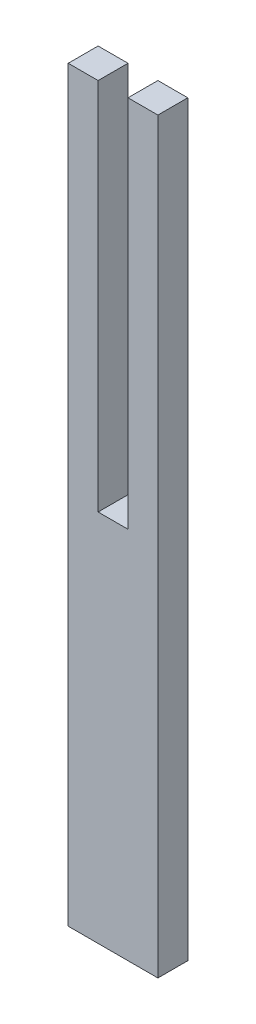
ISO-10303-21;
HEADER;
FILE_DESCRIPTION(('STEP AP214'),'2;1');
FILE_NAME('part.step','',(''),(''),'','','');
FILE_SCHEMA(('AUTOMOTIVE_DESIGN { 1 0 10303 214 1 1 1 1 }'));
ENDSEC;
DATA;
#1=APPLICATION_CONTEXT('core data for automotive mechanical design processes');
#2=APPLICATION_PROTOCOL_DEFINITION('international standard','automotive_design',2000,#1);
#3=PRODUCT_CONTEXT('',#1,'mechanical');
#4=PRODUCT('Part','Part','',(#3));
#5=PRODUCT_RELATED_PRODUCT_CATEGORY('part','',(#4));
#6=PRODUCT_DEFINITION_FORMATION('','',#4);
#7=PRODUCT_DEFINITION_CONTEXT('part definition',#1,'design');
#8=PRODUCT_DEFINITION('design','',#6,#7);
#9=PRODUCT_DEFINITION_SHAPE('','',#8);
#10=(LENGTH_UNIT() NAMED_UNIT(*) SI_UNIT(.MILLI.,.METRE.));
#11=(NAMED_UNIT(*) PLANE_ANGLE_UNIT() SI_UNIT($,.RADIAN.));
#12=(NAMED_UNIT(*) SI_UNIT($,.STERADIAN.) SOLID_ANGLE_UNIT());
#13=UNCERTAINTY_MEASURE_WITH_UNIT(LENGTH_MEASURE(1.E-05),#10,'distance_accuracy_value','');
#14=(GEOMETRIC_REPRESENTATION_CONTEXT(3) GLOBAL_UNCERTAINTY_ASSIGNED_CONTEXT((#13)) GLOBAL_UNIT_ASSIGNED_CONTEXT((#10,
#11,#12)) REPRESENTATION_CONTEXT('',''));
#15=CARTESIAN_POINT('',(0.,0.,0.));
#16=DIRECTION('',(0.,0.,1.));
#17=DIRECTION('',(1.,0.,0.));
#18=AXIS2_PLACEMENT_3D('',#15,#16,#17);
#19=CARTESIAN_POINT('',(-23.2046590205584,42.8960656443759,5.08));
#20=DIRECTION('',(0.,-1.,0.));
#21=DIRECTION('',(0.,0.,-1.));
#22=AXIS2_PLACEMENT_3D('',#19,#20,#21);
#23=PLANE('',#22);
#24=DIRECTION('',(-1.,0.,0.));
#25=VECTOR('',#24,1.);
#26=CARTESIAN_POINT('',(-23.2046590205584,42.8960656443759,0.));
#27=LINE('',#26,#25);
#28=CARTESIAN_POINT('',(-23.2046590205584,42.8960656443759,0.));
#29=VERTEX_POINT('',#28);
#30=CARTESIAN_POINT('',(-28.2846590205584,42.8960656443759,0.));
#31=VERTEX_POINT('',#30);
#32=EDGE_CURVE('E129',#29,#31,#27,.T.);
#33=ORIENTED_EDGE('',*,*,#32,.T.);
#34=DIRECTION('',(0.,0.,-1.));
#35=VECTOR('',#34,1.);
#36=CARTESIAN_POINT('',(-28.2846590205584,42.8960656443759,5.08));
#37=LINE('',#36,#35);
#38=CARTESIAN_POINT('',(-28.2846590205584,42.8960656443759,5.08));
#39=VERTEX_POINT('',#38);
#40=EDGE_CURVE('E11',#39,#31,#37,.T.);
#41=ORIENTED_EDGE('',*,*,#40,.F.);
#42=DIRECTION('',(-1.,0.,0.));
#43=VECTOR('',#42,1.);
#44=CARTESIAN_POINT('',(-23.2046590205584,42.8960656443759,5.08));
#45=LINE('',#44,#43);
#46=CARTESIAN_POINT('',(-23.2046590205584,42.8960656443759,5.08));
#47=VERTEX_POINT('',#46);
#48=EDGE_CURVE('E143',#47,#39,#45,.T.);
#49=ORIENTED_EDGE('',*,*,#48,.F.);
#50=DIRECTION('',(0.,0.,-1.));
#51=VECTOR('',#50,1.);
#52=CARTESIAN_POINT('',(-23.2046590205584,42.8960656443759,5.08));
#53=LINE('',#52,#51);
#54=EDGE_CURVE('E125',#47,#29,#53,.T.);
#55=ORIENTED_EDGE('',*,*,#54,.T.);
#56=EDGE_LOOP('',(#33,#41,#49,#55));
#57=FACE_BOUND('',#56,.T.);
#58=ADVANCED_FACE('F33',(#57),#23,.F.);
#59=CARTESIAN_POINT('',(-28.2846590205584,42.8960656443759,5.08));
#60=DIRECTION('',(1.,0.,0.));
#61=DIRECTION('',(0.,1.,0.));
#62=AXIS2_PLACEMENT_3D('',#59,#60,#61);
#63=PLANE('',#62);
#64=DIRECTION('',(0.,-1.,0.));
#65=VECTOR('',#64,1.);
#66=CARTESIAN_POINT('',(-28.2846590205584,42.8960656443759,0.));
#67=LINE('',#66,#65);
#68=CARTESIAN_POINT('',(-28.2846590205584,-84.1039343556241,0.));
#69=VERTEX_POINT('',#68);
#70=EDGE_CURVE('E132',#31,#69,#67,.T.);
#71=ORIENTED_EDGE('',*,*,#70,.T.);
#72=DIRECTION('',(0.,0.,-1.));
#73=VECTOR('',#72,1.);
#74=CARTESIAN_POINT('',(-28.2846590205584,-84.1039343556241,5.08));
#75=LINE('',#74,#73);
#76=CARTESIAN_POINT('',(-28.2846590205584,-84.1039343556241,5.08));
#77=VERTEX_POINT('',#76);
#78=EDGE_CURVE('E41',#77,#69,#75,.T.);
#79=ORIENTED_EDGE('',*,*,#78,.F.);
#80=DIRECTION('',(0.,-1.,0.));
#81=VECTOR('',#80,1.);
#82=CARTESIAN_POINT('',(-28.2846590205584,42.8960656443759,5.08));
#83=LINE('',#82,#81);
#84=EDGE_CURVE('E92',#39,#77,#83,.T.);
#85=ORIENTED_EDGE('',*,*,#84,.F.);
#86=ORIENTED_EDGE('',*,*,#40,.T.);
#87=EDGE_LOOP('',(#71,#79,#85,#86));
#88=FACE_BOUND('',#87,.T.);
#89=ADVANCED_FACE('F178',(#88),#63,.F.);
#90=CARTESIAN_POINT('',(-28.2846590205584,-84.1039343556241,5.08));
#91=DIRECTION('',(0.,1.,0.));
#92=DIRECTION('',(0.,0.,1.));
#93=AXIS2_PLACEMENT_3D('',#90,#91,#92);
#94=PLANE('',#93);
#95=DIRECTION('',(1.,0.,0.));
#96=VECTOR('',#95,1.);
#97=CARTESIAN_POINT('',(-28.2846590205584,-84.1039343556241,0.));
#98=LINE('',#97,#96);
#99=CARTESIAN_POINT('',(-13.0446590205584,-84.1039343556241,0.));
#100=VERTEX_POINT('',#99);
#101=EDGE_CURVE('E134',#69,#100,#98,.T.);
#102=ORIENTED_EDGE('',*,*,#101,.T.);
#103=DIRECTION('',(0.,0.,-1.));
#104=VECTOR('',#103,1.);
#105=CARTESIAN_POINT('',(-13.0446590205584,-84.1039343556241,5.08));
#106=LINE('',#105,#104);
#107=CARTESIAN_POINT('',(-13.0446590205584,-84.1039343556241,5.08));
#108=VERTEX_POINT('',#107);
#109=EDGE_CURVE('E150',#108,#100,#106,.T.);
#110=ORIENTED_EDGE('',*,*,#109,.F.);
#111=DIRECTION('',(1.,0.,0.));
#112=VECTOR('',#111,1.);
#113=CARTESIAN_POINT('',(-28.2846590205584,-84.1039343556241,5.08));
#114=LINE('',#113,#112);
#115=EDGE_CURVE('E158',#77,#108,#114,.T.);
#116=ORIENTED_EDGE('',*,*,#115,.F.);
#117=ORIENTED_EDGE('',*,*,#78,.T.);
#118=EDGE_LOOP('',(#102,#110,#116,#117));
#119=FACE_BOUND('',#118,.T.);
#120=ADVANCED_FACE('F156',(#119),#94,.F.);
#121=CARTESIAN_POINT('',(-13.0446590205584,-84.1039343556241,5.08));
#122=DIRECTION('',(-1.,0.,0.));
#123=DIRECTION('',(0.,0.,1.));
#124=AXIS2_PLACEMENT_3D('',#121,#122,#123);
#125=PLANE('',#124);
#126=DIRECTION('',(0.,1.,0.));
#127=VECTOR('',#126,1.);
#128=CARTESIAN_POINT('',(-13.0446590205584,-84.1039343556241,0.));
#129=LINE('',#128,#127);
#130=CARTESIAN_POINT('',(-13.0446590205584,42.8960656443759,0.));
#131=VERTEX_POINT('',#130);
#132=EDGE_CURVE('E136',#100,#131,#129,.T.);
#133=ORIENTED_EDGE('',*,*,#132,.T.);
#134=DIRECTION('',(0.,0.,-1.));
#135=VECTOR('',#134,1.);
#136=CARTESIAN_POINT('',(-13.0446590205584,42.8960656443759,5.08));
#137=LINE('',#136,#135);
#138=CARTESIAN_POINT('',(-13.0446590205584,42.8960656443759,5.08));
#139=VERTEX_POINT('',#138);
#140=EDGE_CURVE('E147',#139,#131,#137,.T.);
#141=ORIENTED_EDGE('',*,*,#140,.F.);
#142=DIRECTION('',(0.,1.,0.));
#143=VECTOR('',#142,1.);
#144=CARTESIAN_POINT('',(-13.0446590205584,-84.1039343556241,5.08));
#145=LINE('',#144,#143);
#146=EDGE_CURVE('E170',#108,#139,#145,.T.);
#147=ORIENTED_EDGE('',*,*,#146,.F.);
#148=ORIENTED_EDGE('',*,*,#109,.T.);
#149=EDGE_LOOP('',(#133,#141,#147,#148));
#150=FACE_BOUND('',#149,.T.);
#151=ADVANCED_FACE('F166',(#150),#125,.F.);
#152=CARTESIAN_POINT('',(-13.0446590205584,42.8960656443759,5.08));
#153=DIRECTION('',(0.,-1.,0.));
#154=DIRECTION('',(0.,0.,-1.));
#155=AXIS2_PLACEMENT_3D('',#152,#153,#154);
#156=PLANE('',#155);
#157=DIRECTION('',(-1.,0.,0.));
#158=VECTOR('',#157,1.);
#159=CARTESIAN_POINT('',(-13.0446590205584,42.8960656443759,0.));
#160=LINE('',#159,#158);
#161=CARTESIAN_POINT('',(-18.1246590205584,42.8960656443759,0.));
#162=VERTEX_POINT('',#161);
#163=EDGE_CURVE('E138',#131,#162,#160,.T.);
#164=ORIENTED_EDGE('',*,*,#163,.T.);
#165=DIRECTION('',(0.,0.,-1.));
#166=VECTOR('',#165,1.);
#167=CARTESIAN_POINT('',(-18.1246590205584,42.8960656443759,5.08));
#168=LINE('',#167,#166);
#169=CARTESIAN_POINT('',(-18.1246590205584,42.8960656443759,5.08));
#170=VERTEX_POINT('',#169);
#171=EDGE_CURVE('E120',#170,#162,#168,.T.);
#172=ORIENTED_EDGE('',*,*,#171,.F.);
#173=DIRECTION('',(-1.,0.,0.));
#174=VECTOR('',#173,1.);
#175=CARTESIAN_POINT('',(-13.0446590205584,42.8960656443759,5.08));
#176=LINE('',#175,#174);
#177=EDGE_CURVE('E111',#139,#170,#176,.T.);
#178=ORIENTED_EDGE('',*,*,#177,.F.);
#179=ORIENTED_EDGE('',*,*,#140,.T.);
#180=EDGE_LOOP('',(#164,#172,#178,#179));
#181=FACE_BOUND('',#180,.T.);
#182=ADVANCED_FACE('F169',(#181),#156,.F.);
#183=CARTESIAN_POINT('',(-18.1246590205584,42.8960656443759,5.08));
#184=DIRECTION('',(1.,0.,0.));
#185=DIRECTION('',(0.,1.,0.));
#186=AXIS2_PLACEMENT_3D('',#183,#184,#185);
#187=PLANE('',#186);
#188=DIRECTION('',(0.,-1.,0.));
#189=VECTOR('',#188,1.);
#190=CARTESIAN_POINT('',(-18.1246590205584,42.8960656443759,0.));
#191=LINE('',#190,#189);
#192=CARTESIAN_POINT('',(-18.1246590205584,-20.6039343556241,0.));
#193=VERTEX_POINT('',#192);
#194=EDGE_CURVE('E119',#162,#193,#191,.T.);
#195=ORIENTED_EDGE('',*,*,#194,.T.);
#196=DIRECTION('',(0.,0.,-1.));
#197=VECTOR('',#196,1.);
#198=CARTESIAN_POINT('',(-18.1246590205584,-20.6039343556241,5.08));
#199=LINE('',#198,#197);
#200=CARTESIAN_POINT('',(-18.1246590205584,-20.6039343556241,5.08));
#201=VERTEX_POINT('',#200);
#202=EDGE_CURVE('E116',#201,#193,#199,.T.);
#203=ORIENTED_EDGE('',*,*,#202,.F.);
#204=DIRECTION('',(0.,-1.,0.));
#205=VECTOR('',#204,1.);
#206=CARTESIAN_POINT('',(-18.1246590205584,42.8960656443759,5.08));
#207=LINE('',#206,#205);
#208=EDGE_CURVE('E105',#170,#201,#207,.T.);
#209=ORIENTED_EDGE('',*,*,#208,.F.);
#210=ORIENTED_EDGE('',*,*,#171,.T.);
#211=EDGE_LOOP('',(#195,#203,#209,#210));
#212=FACE_BOUND('',#211,.T.);
#213=ADVANCED_FACE('F117',(#212),#187,.F.);
#214=CARTESIAN_POINT('',(-18.1246590205584,-20.6039343556241,5.08));
#215=DIRECTION('',(0.,-1.,0.));
#216=DIRECTION('',(0.,0.,-1.));
#217=AXIS2_PLACEMENT_3D('',#214,#215,#216);
#218=PLANE('',#217);
#219=DIRECTION('',(-1.,0.,0.));
#220=VECTOR('',#219,1.);
#221=CARTESIAN_POINT('',(-18.1246590205584,-20.6039343556241,0.));
#222=LINE('',#221,#220);
#223=CARTESIAN_POINT('',(-23.2046590205584,-20.6039343556241,0.));
#224=VERTEX_POINT('',#223);
#225=EDGE_CURVE('E78',#193,#224,#222,.T.);
#226=ORIENTED_EDGE('',*,*,#225,.T.);
#227=DIRECTION('',(0.,0.,-1.));
#228=VECTOR('',#227,1.);
#229=CARTESIAN_POINT('',(-23.2046590205584,-20.6039343556241,5.08));
#230=LINE('',#229,#228);
#231=CARTESIAN_POINT('',(-23.2046590205584,-20.6039343556241,5.08));
#232=VERTEX_POINT('',#231);
#233=EDGE_CURVE('E121',#232,#224,#230,.T.);
#234=ORIENTED_EDGE('',*,*,#233,.F.);
#235=DIRECTION('',(-1.,0.,0.));
#236=VECTOR('',#235,1.);
#237=CARTESIAN_POINT('',(-18.1246590205584,-20.6039343556241,5.08));
#238=LINE('',#237,#236);
#239=EDGE_CURVE('E109',#201,#232,#238,.T.);
#240=ORIENTED_EDGE('',*,*,#239,.F.);
#241=ORIENTED_EDGE('',*,*,#202,.T.);
#242=EDGE_LOOP('',(#226,#234,#240,#241));
#243=FACE_BOUND('',#242,.T.);
#244=ADVANCED_FACE('F123',(#243),#218,.F.);
#245=CARTESIAN_POINT('',(-23.2046590205584,-20.6039343556241,5.08));
#246=DIRECTION('',(-1.,0.,0.));
#247=DIRECTION('',(0.,-1.,0.));
#248=AXIS2_PLACEMENT_3D('',#245,#246,#247);
#249=PLANE('',#248);
#250=DIRECTION('',(0.,1.,0.));
#251=VECTOR('',#250,1.);
#252=CARTESIAN_POINT('',(-23.2046590205584,-20.6039343556241,0.));
#253=LINE('',#252,#251);
#254=EDGE_CURVE('E84',#224,#29,#253,.T.);
#255=ORIENTED_EDGE('',*,*,#254,.T.);
#256=ORIENTED_EDGE('',*,*,#54,.F.);
#257=DIRECTION('',(0.,1.,0.));
#258=VECTOR('',#257,1.);
#259=CARTESIAN_POINT('',(-23.2046590205584,-20.6039343556241,5.08));
#260=LINE('',#259,#258);
#261=EDGE_CURVE('E49',#232,#47,#260,.T.);
#262=ORIENTED_EDGE('',*,*,#261,.F.);
#263=ORIENTED_EDGE('',*,*,#233,.T.);
#264=EDGE_LOOP('',(#255,#256,#262,#263));
#265=FACE_BOUND('',#264,.T.);
#266=ADVANCED_FACE('F194',(#265),#249,.F.);
#267=CARTESIAN_POINT('',(0.,0.,5.08));
#268=DIRECTION('',(0.,0.,1.));
#269=DIRECTION('',(1.,0.,0.));
#270=AXIS2_PLACEMENT_3D('',#267,#268,#269);
#271=PLANE('',#270);
#272=ORIENTED_EDGE('',*,*,#48,.T.);
#273=ORIENTED_EDGE('',*,*,#84,.T.);
#274=ORIENTED_EDGE('',*,*,#115,.T.);
#275=ORIENTED_EDGE('',*,*,#146,.T.);
#276=ORIENTED_EDGE('',*,*,#177,.T.);
#277=ORIENTED_EDGE('',*,*,#208,.T.);
#278=ORIENTED_EDGE('',*,*,#239,.T.);
#279=ORIENTED_EDGE('',*,*,#261,.T.);
#280=EDGE_LOOP('',(#272,#273,#274,#275,#276,#277,#278,#279));
#281=FACE_BOUND('',#280,.T.);
#282=ADVANCED_FACE('F107',(#281),#271,.T.);
#283=CARTESIAN_POINT('',(0.,0.,0.));
#284=DIRECTION('',(0.,0.,1.));
#285=DIRECTION('',(1.,0.,0.));
#286=AXIS2_PLACEMENT_3D('',#283,#284,#285);
#287=PLANE('',#286);
#288=ORIENTED_EDGE('',*,*,#32,.F.);
#289=ORIENTED_EDGE('',*,*,#254,.F.);
#290=ORIENTED_EDGE('',*,*,#225,.F.);
#291=ORIENTED_EDGE('',*,*,#194,.F.);
#292=ORIENTED_EDGE('',*,*,#163,.F.);
#293=ORIENTED_EDGE('',*,*,#132,.F.);
#294=ORIENTED_EDGE('',*,*,#101,.F.);
#295=ORIENTED_EDGE('',*,*,#70,.F.);
#296=EDGE_LOOP('',(#288,#289,#290,#291,#292,#293,#294,#295));
#297=FACE_BOUND('',#296,.T.);
#298=ADVANCED_FACE('F162',(#297),#287,.F.);
#299=CLOSED_SHELL('',(#58,#89,#120,#151,#182,#213,#244,#266,#282,#298));
#300=MANIFOLD_SOLID_BREP('B2',#299);
#301=ADVANCED_BREP_SHAPE_REPRESENTATION('',(#18,#300),#14);
#302=SHAPE_DEFINITION_REPRESENTATION(#9,#301);
ENDSEC;
END-ISO-10303-21;
